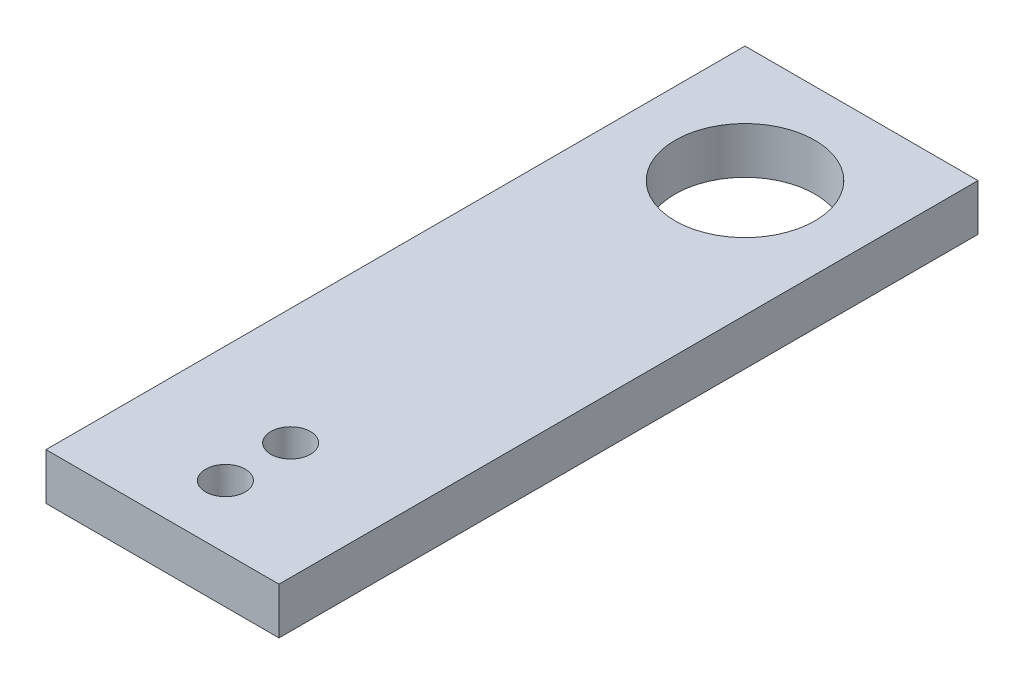
ISO-10303-21;
HEADER;
FILE_DESCRIPTION(('STEP AP214'),'2;1');
FILE_NAME('part.step','',(''),(''),'','','');
FILE_SCHEMA(('AUTOMOTIVE_DESIGN { 1 0 10303 214 1 1 1 1 }'));
ENDSEC;
DATA;
#1=APPLICATION_CONTEXT('core data for automotive mechanical design processes');
#2=APPLICATION_PROTOCOL_DEFINITION('international standard','automotive_design',2000,#1);
#3=PRODUCT_CONTEXT('',#1,'mechanical');
#4=PRODUCT('Part','Part','',(#3));
#5=PRODUCT_RELATED_PRODUCT_CATEGORY('part','',(#4));
#6=PRODUCT_DEFINITION_FORMATION('','',#4);
#7=PRODUCT_DEFINITION_CONTEXT('part definition',#1,'design');
#8=PRODUCT_DEFINITION('design','',#6,#7);
#9=PRODUCT_DEFINITION_SHAPE('','',#8);
#10=(LENGTH_UNIT() NAMED_UNIT(*) SI_UNIT(.MILLI.,.METRE.));
#11=(NAMED_UNIT(*) PLANE_ANGLE_UNIT() SI_UNIT($,.RADIAN.));
#12=(NAMED_UNIT(*) SI_UNIT($,.STERADIAN.) SOLID_ANGLE_UNIT());
#13=UNCERTAINTY_MEASURE_WITH_UNIT(LENGTH_MEASURE(1.E-05),#10,'distance_accuracy_value','');
#14=(GEOMETRIC_REPRESENTATION_CONTEXT(3) GLOBAL_UNCERTAINTY_ASSIGNED_CONTEXT((#13)) GLOBAL_UNIT_ASSIGNED_CONTEXT((#10,
#11,#12)) REPRESENTATION_CONTEXT('',''));
#15=CARTESIAN_POINT('',(0.,0.,0.));
#16=DIRECTION('',(0.,0.,1.));
#17=DIRECTION('',(1.,0.,0.));
#18=AXIS2_PLACEMENT_3D('',#15,#16,#17);
#19=CARTESIAN_POINT('',(0.,10.,0.));
#20=DIRECTION('',(0.,1.,0.));
#21=DIRECTION('',(0.,0.,1.));
#22=AXIS2_PLACEMENT_3D('',#19,#20,#21);
#23=PLANE('',#22);
#24=CARTESIAN_POINT('',(0.,10.,111.5));
#25=DIRECTION('',(0.,1.,0.));
#26=DIRECTION('',(0.,0.,1.));
#27=AXIS2_PLACEMENT_3D('',#24,#25,#26);
#28=CIRCLE('',#27,4.25);
#29=CARTESIAN_POINT('',(0.,10.,115.75));
#30=VERTEX_POINT('',#29);
#31=EDGE_CURVE('E140',#30,#30,#28,.T.);
#32=ORIENTED_EDGE('',*,*,#31,.F.);
#33=EDGE_LOOP('',(#32));
#34=FACE_BOUND('',#33,.T.);
#35=CARTESIAN_POINT('',(0.,10.,97.5));
#36=DIRECTION('',(0.,1.,0.));
#37=DIRECTION('',(0.,0.,1.));
#38=AXIS2_PLACEMENT_3D('',#35,#36,#37);
#39=CIRCLE('',#38,4.25000000000001);
#40=CARTESIAN_POINT('',(0.,10.,101.75));
#41=VERTEX_POINT('',#40);
#42=EDGE_CURVE('E144',#41,#41,#39,.T.);
#43=ORIENTED_EDGE('',*,*,#42,.F.);
#44=EDGE_LOOP('',(#43));
#45=FACE_BOUND('',#44,.T.);
#46=DIRECTION('',(0.,0.,-1.));
#47=VECTOR('',#46,1.);
#48=CARTESIAN_POINT('',(25.,10.,-25.));
#49=LINE('',#48,#47);
#50=CARTESIAN_POINT('',(25.0000000000001,10.,125.));
#51=VERTEX_POINT('',#50);
#52=CARTESIAN_POINT('',(25.,10.,-25.));
#53=VERTEX_POINT('',#52);
#54=EDGE_CURVE('E98',#51,#53,#49,.T.);
#55=ORIENTED_EDGE('',*,*,#54,.T.);
#56=DIRECTION('',(-1.,0.,0.));
#57=VECTOR('',#56,1.);
#58=CARTESIAN_POINT('',(25.,10.,-25.));
#59=LINE('',#58,#57);
#60=CARTESIAN_POINT('',(-25.,10.,-25.));
#61=VERTEX_POINT('',#60);
#62=EDGE_CURVE('E93',#53,#61,#59,.T.);
#63=ORIENTED_EDGE('',*,*,#62,.T.);
#64=DIRECTION('',(0.,0.,1.));
#65=VECTOR('',#64,1.);
#66=CARTESIAN_POINT('',(-25.,10.,-25.));
#67=LINE('',#66,#65);
#68=CARTESIAN_POINT('',(-25.,10.,125.));
#69=VERTEX_POINT('',#68);
#70=EDGE_CURVE('E96',#61,#69,#67,.T.);
#71=ORIENTED_EDGE('',*,*,#70,.T.);
#72=DIRECTION('',(1.,0.,0.));
#73=VECTOR('',#72,1.);
#74=CARTESIAN_POINT('',(-25.,10.,125.));
#75=LINE('',#74,#73);
#76=EDGE_CURVE('E63',#69,#51,#75,.T.);
#77=ORIENTED_EDGE('',*,*,#76,.T.);
#78=EDGE_LOOP('',(#55,#63,#71,#77));
#79=FACE_BOUND('',#78,.T.);
#80=CARTESIAN_POINT('',(0.,10.,0.));
#81=DIRECTION('',(0.,1.,0.));
#82=DIRECTION('',(0.,0.,1.));
#83=AXIS2_PLACEMENT_3D('',#80,#81,#82);
#84=CIRCLE('',#83,15.);
#85=CARTESIAN_POINT('',(0.,10.,15.));
#86=VERTEX_POINT('',#85);
#87=EDGE_CURVE('E118',#86,#86,#84,.T.);
#88=ORIENTED_EDGE('',*,*,#87,.F.);
#89=EDGE_LOOP('',(#88));
#90=FACE_BOUND('',#89,.T.);
#91=ADVANCED_FACE('F45',(#34,#45,#79,#90),#23,.T.);
#92=CARTESIAN_POINT('',(0.,0.,0.));
#93=DIRECTION('',(0.,1.,0.));
#94=DIRECTION('',(0.,0.,1.));
#95=AXIS2_PLACEMENT_3D('',#92,#93,#94);
#96=PLANE('',#95);
#97=CARTESIAN_POINT('',(0.,0.,111.5));
#98=DIRECTION('',(0.,1.,0.));
#99=DIRECTION('',(0.,0.,1.));
#100=AXIS2_PLACEMENT_3D('',#97,#98,#99);
#101=CIRCLE('',#100,4.25);
#102=CARTESIAN_POINT('',(0.,0.,115.75));
#103=VERTEX_POINT('',#102);
#104=EDGE_CURVE('E152',#103,#103,#101,.T.);
#105=ORIENTED_EDGE('',*,*,#104,.T.);
#106=EDGE_LOOP('',(#105));
#107=FACE_BOUND('',#106,.T.);
#108=CARTESIAN_POINT('',(0.,0.,97.5));
#109=DIRECTION('',(0.,1.,0.));
#110=DIRECTION('',(0.,0.,1.));
#111=AXIS2_PLACEMENT_3D('',#108,#109,#110);
#112=CIRCLE('',#111,4.25000000000001);
#113=CARTESIAN_POINT('',(0.,0.,101.75));
#114=VERTEX_POINT('',#113);
#115=EDGE_CURVE('E148',#114,#114,#112,.T.);
#116=ORIENTED_EDGE('',*,*,#115,.T.);
#117=EDGE_LOOP('',(#116));
#118=FACE_BOUND('',#117,.T.);
#119=DIRECTION('',(0.,0.,-1.));
#120=VECTOR('',#119,1.);
#121=CARTESIAN_POINT('',(25.,0.,-25.));
#122=LINE('',#121,#120);
#123=CARTESIAN_POINT('',(25.0000000000001,0.,125.));
#124=VERTEX_POINT('',#123);
#125=CARTESIAN_POINT('',(25.,0.,-25.));
#126=VERTEX_POINT('',#125);
#127=EDGE_CURVE('E114',#124,#126,#122,.T.);
#128=ORIENTED_EDGE('',*,*,#127,.F.);
#129=DIRECTION('',(1.,0.,0.));
#130=VECTOR('',#129,1.);
#131=CARTESIAN_POINT('',(-25.,0.,125.));
#132=LINE('',#131,#130);
#133=CARTESIAN_POINT('',(-25.,0.,125.));
#134=VERTEX_POINT('',#133);
#135=EDGE_CURVE('E86',#134,#124,#132,.T.);
#136=ORIENTED_EDGE('',*,*,#135,.F.);
#137=DIRECTION('',(0.,0.,1.));
#138=VECTOR('',#137,1.);
#139=CARTESIAN_POINT('',(-25.,0.,-25.));
#140=LINE('',#139,#138);
#141=CARTESIAN_POINT('',(-25.,0.,-25.));
#142=VERTEX_POINT('',#141);
#143=EDGE_CURVE('E80',#142,#134,#140,.T.);
#144=ORIENTED_EDGE('',*,*,#143,.F.);
#145=DIRECTION('',(-1.,0.,0.));
#146=VECTOR('',#145,1.);
#147=CARTESIAN_POINT('',(25.,0.,-25.));
#148=LINE('',#147,#146);
#149=EDGE_CURVE('E103',#126,#142,#148,.T.);
#150=ORIENTED_EDGE('',*,*,#149,.F.);
#151=EDGE_LOOP('',(#128,#136,#144,#150));
#152=FACE_BOUND('',#151,.T.);
#153=CARTESIAN_POINT('',(0.,0.,0.));
#154=DIRECTION('',(0.,1.,0.));
#155=DIRECTION('',(0.,0.,1.));
#156=AXIS2_PLACEMENT_3D('',#153,#154,#155);
#157=CIRCLE('',#156,15.);
#158=CARTESIAN_POINT('',(0.,0.,15.));
#159=VERTEX_POINT('',#158);
#160=EDGE_CURVE('E136',#159,#159,#157,.T.);
#161=ORIENTED_EDGE('',*,*,#160,.T.);
#162=EDGE_LOOP('',(#161));
#163=FACE_BOUND('',#162,.T.);
#164=ADVANCED_FACE('F131',(#107,#118,#152,#163),#96,.F.);
#165=CARTESIAN_POINT('',(25.,10.,-25.));
#166=DIRECTION('',(-1.,0.,0.));
#167=DIRECTION('',(0.,0.,1.));
#168=AXIS2_PLACEMENT_3D('',#165,#166,#167);
#169=PLANE('',#168);
#170=ORIENTED_EDGE('',*,*,#127,.T.);
#171=DIRECTION('',(0.,-1.,0.));
#172=VECTOR('',#171,1.);
#173=CARTESIAN_POINT('',(25.,10.,-25.));
#174=LINE('',#173,#172);
#175=EDGE_CURVE('E11',#53,#126,#174,.T.);
#176=ORIENTED_EDGE('',*,*,#175,.F.);
#177=ORIENTED_EDGE('',*,*,#54,.F.);
#178=DIRECTION('',(0.,-1.,0.));
#179=VECTOR('',#178,1.);
#180=CARTESIAN_POINT('',(25.0000000000001,10.,125.));
#181=LINE('',#180,#179);
#182=EDGE_CURVE('E110',#51,#124,#181,.T.);
#183=ORIENTED_EDGE('',*,*,#182,.T.);
#184=EDGE_LOOP('',(#170,#176,#177,#183));
#185=FACE_BOUND('',#184,.T.);
#186=ADVANCED_FACE('F47',(#185),#169,.F.);
#187=CARTESIAN_POINT('',(25.,10.,-25.));
#188=DIRECTION('',(0.,0.,1.));
#189=DIRECTION('',(1.,0.,0.));
#190=AXIS2_PLACEMENT_3D('',#187,#188,#189);
#191=PLANE('',#190);
#192=ORIENTED_EDGE('',*,*,#149,.T.);
#193=DIRECTION('',(0.,-1.,0.));
#194=VECTOR('',#193,1.);
#195=CARTESIAN_POINT('',(-25.,10.,-25.));
#196=LINE('',#195,#194);
#197=EDGE_CURVE('E55',#61,#142,#196,.T.);
#198=ORIENTED_EDGE('',*,*,#197,.F.);
#199=ORIENTED_EDGE('',*,*,#62,.F.);
#200=ORIENTED_EDGE('',*,*,#175,.T.);
#201=EDGE_LOOP('',(#192,#198,#199,#200));
#202=FACE_BOUND('',#201,.T.);
#203=ADVANCED_FACE('F102',(#202),#191,.F.);
#204=CARTESIAN_POINT('',(-25.,10.,-25.));
#205=DIRECTION('',(1.,0.,0.));
#206=DIRECTION('',(0.,0.,-1.));
#207=AXIS2_PLACEMENT_3D('',#204,#205,#206);
#208=PLANE('',#207);
#209=ORIENTED_EDGE('',*,*,#143,.T.);
#210=DIRECTION('',(0.,-1.,0.));
#211=VECTOR('',#210,1.);
#212=CARTESIAN_POINT('',(-25.,10.,125.));
#213=LINE('',#212,#211);
#214=EDGE_CURVE('E105',#69,#134,#213,.T.);
#215=ORIENTED_EDGE('',*,*,#214,.F.);
#216=ORIENTED_EDGE('',*,*,#70,.F.);
#217=ORIENTED_EDGE('',*,*,#197,.T.);
#218=EDGE_LOOP('',(#209,#215,#216,#217));
#219=FACE_BOUND('',#218,.T.);
#220=ADVANCED_FACE('F106',(#219),#208,.F.);
#221=CARTESIAN_POINT('',(-25.,10.,125.));
#222=DIRECTION('',(0.,0.,-1.));
#223=DIRECTION('',(-1.,0.,0.));
#224=AXIS2_PLACEMENT_3D('',#221,#222,#223);
#225=PLANE('',#224);
#226=ORIENTED_EDGE('',*,*,#135,.T.);
#227=ORIENTED_EDGE('',*,*,#182,.F.);
#228=ORIENTED_EDGE('',*,*,#76,.F.);
#229=ORIENTED_EDGE('',*,*,#214,.T.);
#230=EDGE_LOOP('',(#226,#227,#228,#229));
#231=FACE_BOUND('',#230,.T.);
#232=ADVANCED_FACE('F128',(#231),#225,.F.);
#233=CARTESIAN_POINT('',(0.,10.,0.));
#234=DIRECTION('',(0.,-1.,0.));
#235=DIRECTION('',(0.,0.,-1.));
#236=AXIS2_PLACEMENT_3D('',#233,#234,#235);
#237=CYLINDRICAL_SURFACE('',#236,15.);
#238=ORIENTED_EDGE('',*,*,#87,.T.);
#239=EDGE_LOOP('',(#238));
#240=FACE_BOUND('',#239,.T.);
#241=ORIENTED_EDGE('',*,*,#160,.F.);
#242=EDGE_LOOP('',(#241));
#243=FACE_BOUND('',#242,.T.);
#244=ADVANCED_FACE('F171',(#240,#243),#237,.F.);
#245=CARTESIAN_POINT('',(0.,10.,97.5));
#246=DIRECTION('',(0.,-1.,0.));
#247=DIRECTION('',(0.,0.,-1.));
#248=AXIS2_PLACEMENT_3D('',#245,#246,#247);
#249=CYLINDRICAL_SURFACE('',#248,4.25000000000001);
#250=ORIENTED_EDGE('',*,*,#42,.T.);
#251=EDGE_LOOP('',(#250));
#252=FACE_BOUND('',#251,.T.);
#253=ORIENTED_EDGE('',*,*,#115,.F.);
#254=EDGE_LOOP('',(#253));
#255=FACE_BOUND('',#254,.T.);
#256=ADVANCED_FACE('F168',(#252,#255),#249,.F.);
#257=CARTESIAN_POINT('',(0.,10.,111.5));
#258=DIRECTION('',(0.,-1.,0.));
#259=DIRECTION('',(0.,0.,-1.));
#260=AXIS2_PLACEMENT_3D('',#257,#258,#259);
#261=CYLINDRICAL_SURFACE('',#260,4.25);
#262=ORIENTED_EDGE('',*,*,#31,.T.);
#263=EDGE_LOOP('',(#262));
#264=FACE_BOUND('',#263,.T.);
#265=ORIENTED_EDGE('',*,*,#104,.F.);
#266=EDGE_LOOP('',(#265));
#267=FACE_BOUND('',#266,.T.);
#268=ADVANCED_FACE('F160',(#264,#267),#261,.F.);
#269=CLOSED_SHELL('',(#91,#164,#186,#203,#220,#232,#244,#256,#268));
#270=MANIFOLD_SOLID_BREP('B2',#269);
#271=ADVANCED_BREP_SHAPE_REPRESENTATION('',(#18,#270),#14);
#272=SHAPE_DEFINITION_REPRESENTATION(#9,#271);
ENDSEC;
END-ISO-10303-21;
